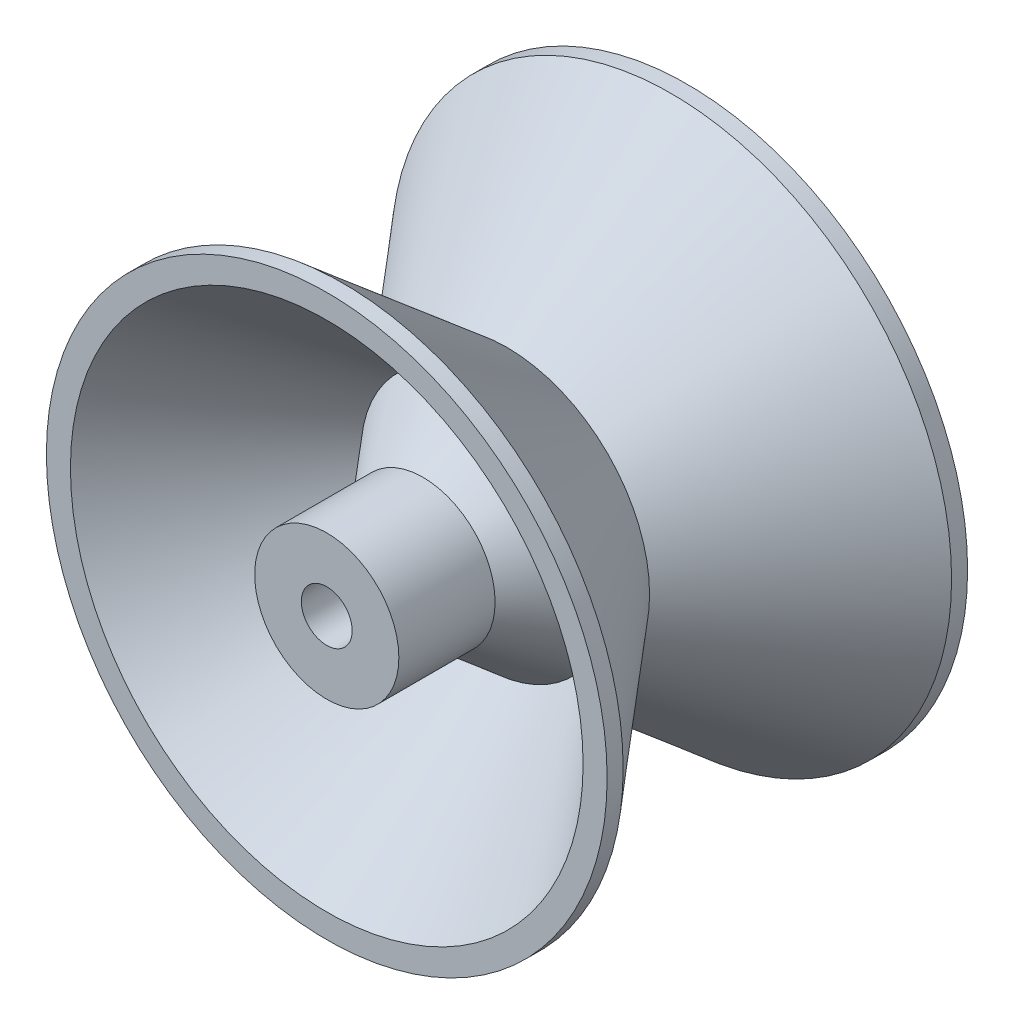
ISO-10303-21;
HEADER;
FILE_DESCRIPTION(('STEP AP214'),'2;1');
FILE_NAME('part.step','',(''),(''),'','','');
FILE_SCHEMA(('AUTOMOTIVE_DESIGN { 1 0 10303 214 1 1 1 1 }'));
ENDSEC;
DATA;
#1=APPLICATION_CONTEXT('core data for automotive mechanical design processes');
#2=APPLICATION_PROTOCOL_DEFINITION('international standard','automotive_design',2000,#1);
#3=PRODUCT_CONTEXT('',#1,'mechanical');
#4=PRODUCT('Part','Part','',(#3));
#5=PRODUCT_RELATED_PRODUCT_CATEGORY('part','',(#4));
#6=PRODUCT_DEFINITION_FORMATION('','',#4);
#7=PRODUCT_DEFINITION_CONTEXT('part definition',#1,'design');
#8=PRODUCT_DEFINITION('design','',#6,#7);
#9=PRODUCT_DEFINITION_SHAPE('','',#8);
#10=(LENGTH_UNIT() NAMED_UNIT(*) SI_UNIT(.MILLI.,.METRE.));
#11=(NAMED_UNIT(*) PLANE_ANGLE_UNIT() SI_UNIT($,.RADIAN.));
#12=(NAMED_UNIT(*) SI_UNIT($,.STERADIAN.) SOLID_ANGLE_UNIT());
#13=UNCERTAINTY_MEASURE_WITH_UNIT(LENGTH_MEASURE(1.E-05),#10,'distance_accuracy_value','');
#14=(GEOMETRIC_REPRESENTATION_CONTEXT(3) GLOBAL_UNCERTAINTY_ASSIGNED_CONTEXT((#13)) GLOBAL_UNIT_ASSIGNED_CONTEXT((#10,
#11,#12)) REPRESENTATION_CONTEXT('',''));
#15=CARTESIAN_POINT('',(0.,0.,0.));
#16=DIRECTION('',(0.,0.,1.));
#17=DIRECTION('',(1.,0.,0.));
#18=AXIS2_PLACEMENT_3D('',#15,#16,#17);
#19=CARTESIAN_POINT('',(9.,0.,0.));
#20=DIRECTION('',(0.,0.,1.));
#21=DIRECTION('',(1.,0.,0.));
#22=AXIS2_PLACEMENT_3D('',#19,#20,#21);
#23=PLANE('',#22);
#24=CARTESIAN_POINT('',(0.,0.,0.));
#25=DIRECTION('',(0.,0.,1.));
#26=DIRECTION('',(1.,0.,0.));
#27=AXIS2_PLACEMENT_3D('',#24,#25,#26);
#28=CIRCLE('',#27,9.);
#29=CARTESIAN_POINT('',(9.,0.,0.));
#30=VERTEX_POINT('',#29);
#31=EDGE_CURVE('E10',#30,#30,#28,.T.);
#32=ORIENTED_EDGE('',*,*,#31,.T.);
#33=EDGE_LOOP('',(#32));
#34=FACE_BOUND('',#33,.T.);
#35=CARTESIAN_POINT('',(0.,0.,0.));
#36=DIRECTION('',(0.,0.,1.));
#37=DIRECTION('',(1.,0.,0.));
#38=AXIS2_PLACEMENT_3D('',#35,#36,#37);
#39=CIRCLE('',#38,3.175);
#40=CARTESIAN_POINT('',(3.175,0.,0.));
#41=VERTEX_POINT('',#40);
#42=EDGE_CURVE('E92',#41,#41,#39,.T.);
#43=ORIENTED_EDGE('',*,*,#42,.F.);
#44=EDGE_LOOP('',(#43));
#45=FACE_BOUND('',#44,.T.);
#46=ADVANCED_FACE('F31',(#34,#45),#23,.T.);
#47=CARTESIAN_POINT('',(0.,0.,0.));
#48=DIRECTION('',(0.,0.,1.));
#49=DIRECTION('',(1.,0.,0.));
#50=AXIS2_PLACEMENT_3D('',#47,#48,#49);
#51=CYLINDRICAL_SURFACE('',#50,9.);
#52=CARTESIAN_POINT('',(0.,0.,-12.0144065925504));
#53=DIRECTION('',(0.,0.,1.));
#54=DIRECTION('',(1.,0.,0.));
#55=AXIS2_PLACEMENT_3D('',#52,#53,#54);
#56=CIRCLE('',#55,9.);
#57=CARTESIAN_POINT('',(9.,0.,-12.0144065925504));
#58=VERTEX_POINT('',#57);
#59=EDGE_CURVE('E37',#58,#58,#56,.T.);
#60=ORIENTED_EDGE('',*,*,#59,.T.);
#61=EDGE_LOOP('',(#60));
#62=FACE_BOUND('',#61,.T.);
#63=ORIENTED_EDGE('',*,*,#31,.F.);
#64=EDGE_LOOP('',(#63));
#65=FACE_BOUND('',#64,.T.);
#66=ADVANCED_FACE('F100',(#62,#65),#51,.T.);
#67=CARTESIAN_POINT('',(0.,0.,-12.0144065925504));
#68=DIRECTION('',(0.,0.,-1.));
#69=DIRECTION('',(-1.,0.,0.));
#70=AXIS2_PLACEMENT_3D('',#67,#68,#69);
#71=CONICAL_SURFACE('',#70,9.,0.69813170079773);
#72=CARTESIAN_POINT('',(0.,0.,-19.7123696111087));
#73=DIRECTION('',(0.,0.,1.));
#74=DIRECTION('',(1.,0.,0.));
#75=AXIS2_PLACEMENT_3D('',#72,#73,#74);
#76=CIRCLE('',#75,15.4593579296886);
#77=CARTESIAN_POINT('',(15.4593579296886,0.,-19.7123696111087));
#78=VERTEX_POINT('',#77);
#79=EDGE_CURVE('E41',#78,#78,#76,.T.);
#80=ORIENTED_EDGE('',*,*,#79,.T.);
#81=EDGE_LOOP('',(#80));
#82=FACE_BOUND('',#81,.T.);
#83=ORIENTED_EDGE('',*,*,#59,.F.);
#84=EDGE_LOOP('',(#83));
#85=FACE_BOUND('',#84,.T.);
#86=ADVANCED_FACE('F104',(#82,#85),#71,.T.);
#87=CARTESIAN_POINT('',(0.,0.,-19.7123696111087));
#88=DIRECTION('',(0.,0.,1.));
#89=DIRECTION('',(1.,0.,0.));
#90=AXIS2_PLACEMENT_3D('',#87,#88,#89);
#91=CONICAL_SURFACE('',#90,15.4593579296886,0.698131700797729);
#92=CARTESIAN_POINT('',(0.,0.,0.));
#93=DIRECTION('',(0.,0.,1.));
#94=DIRECTION('',(1.,0.,0.));
#95=AXIS2_PLACEMENT_3D('',#92,#93,#94);
#96=CIRCLE('',#95,32.);
#97=CARTESIAN_POINT('',(32.,0.,0.));
#98=VERTEX_POINT('',#97);
#99=EDGE_CURVE('E45',#98,#98,#96,.T.);
#100=ORIENTED_EDGE('',*,*,#99,.T.);
#101=EDGE_LOOP('',(#100));
#102=FACE_BOUND('',#101,.T.);
#103=ORIENTED_EDGE('',*,*,#79,.F.);
#104=EDGE_LOOP('',(#103));
#105=FACE_BOUND('',#104,.T.);
#106=ADVANCED_FACE('F108',(#102,#105),#91,.F.);
#107=CARTESIAN_POINT('',(35.,0.,0.));
#108=DIRECTION('',(0.,0.,1.));
#109=DIRECTION('',(1.,0.,0.));
#110=AXIS2_PLACEMENT_3D('',#107,#108,#109);
#111=PLANE('',#110);
#112=CARTESIAN_POINT('',(0.,0.,0.));
#113=DIRECTION('',(0.,0.,1.));
#114=DIRECTION('',(1.,0.,0.));
#115=AXIS2_PLACEMENT_3D('',#112,#113,#114);
#116=CIRCLE('',#115,35.);
#117=CARTESIAN_POINT('',(35.,0.,0.));
#118=VERTEX_POINT('',#117);
#119=EDGE_CURVE('E50',#118,#118,#116,.T.);
#120=ORIENTED_EDGE('',*,*,#119,.T.);
#121=EDGE_LOOP('',(#120));
#122=FACE_BOUND('',#121,.T.);
#123=ORIENTED_EDGE('',*,*,#99,.F.);
#124=EDGE_LOOP('',(#123));
#125=FACE_BOUND('',#124,.T.);
#126=ADVANCED_FACE('F115',(#122,#125),#111,.T.);
#127=CARTESIAN_POINT('',(0.,0.,0.));
#128=DIRECTION('',(0.,0.,1.));
#129=DIRECTION('',(1.,0.,0.));
#130=AXIS2_PLACEMENT_3D('',#127,#128,#129);
#131=CYLINDRICAL_SURFACE('',#130,35.);
#132=CARTESIAN_POINT('',(0.,0.,-2.));
#133=DIRECTION('',(0.,0.,1.));
#134=DIRECTION('',(1.,0.,0.));
#135=AXIS2_PLACEMENT_3D('',#132,#133,#134);
#136=CIRCLE('',#135,35.);
#137=CARTESIAN_POINT('',(35.,0.,-2.));
#138=VERTEX_POINT('',#137);
#139=EDGE_CURVE('E53',#138,#138,#136,.T.);
#140=ORIENTED_EDGE('',*,*,#139,.T.);
#141=EDGE_LOOP('',(#140));
#142=FACE_BOUND('',#141,.T.);
#143=ORIENTED_EDGE('',*,*,#119,.F.);
#144=EDGE_LOOP('',(#143));
#145=FACE_BOUND('',#144,.T.);
#146=ADVANCED_FACE('F119',(#142,#145),#131,.T.);
#147=CARTESIAN_POINT('',(0.,0.,-2.));
#148=DIRECTION('',(0.,0.,1.));
#149=DIRECTION('',(1.,0.,0.));
#150=AXIS2_PLACEMENT_3D('',#147,#148,#149);
#151=CONICAL_SURFACE('',#150,35.,0.69813170079773);
#152=CARTESIAN_POINT('',(0.,0.,-22.5));
#153=DIRECTION('',(0.,0.,1.));
#154=DIRECTION('',(1.,0.,0.));
#155=AXIS2_PLACEMENT_3D('',#152,#153,#154);
#156=CIRCLE('',#155,17.7984575608658);
#157=CARTESIAN_POINT('',(17.7984575608658,0.,-22.5));
#158=VERTEX_POINT('',#157);
#159=EDGE_CURVE('E56',#158,#158,#156,.T.);
#160=ORIENTED_EDGE('',*,*,#159,.T.);
#161=EDGE_LOOP('',(#160));
#162=FACE_BOUND('',#161,.T.);
#163=ORIENTED_EDGE('',*,*,#139,.F.);
#164=EDGE_LOOP('',(#163));
#165=FACE_BOUND('',#164,.T.);
#166=ADVANCED_FACE('F123',(#162,#165),#151,.T.);
#167=CARTESIAN_POINT('',(0.,0.,-22.5));
#168=DIRECTION('',(0.,0.,-1.));
#169=DIRECTION('',(-1.,0.,0.));
#170=AXIS2_PLACEMENT_3D('',#167,#168,#169);
#171=CONICAL_SURFACE('',#170,17.7984575608658,0.698131700797735);
#172=CARTESIAN_POINT('',(0.,0.,-43.));
#173=DIRECTION('',(0.,0.,1.));
#174=DIRECTION('',(1.,0.,0.));
#175=AXIS2_PLACEMENT_3D('',#172,#173,#174);
#176=CIRCLE('',#175,35.0000000000002);
#177=CARTESIAN_POINT('',(35.0000000000002,0.,-43.));
#178=VERTEX_POINT('',#177);
#179=EDGE_CURVE('E59',#178,#178,#176,.T.);
#180=ORIENTED_EDGE('',*,*,#179,.T.);
#181=EDGE_LOOP('',(#180));
#182=FACE_BOUND('',#181,.T.);
#183=ORIENTED_EDGE('',*,*,#159,.F.);
#184=EDGE_LOOP('',(#183));
#185=FACE_BOUND('',#184,.T.);
#186=ADVANCED_FACE('F127',(#182,#185),#171,.T.);
#187=CARTESIAN_POINT('',(0.,0.,0.));
#188=DIRECTION('',(0.,0.,1.));
#189=DIRECTION('',(1.,0.,0.));
#190=AXIS2_PLACEMENT_3D('',#187,#188,#189);
#191=CYLINDRICAL_SURFACE('',#190,35.0000000000002);
#192=CARTESIAN_POINT('',(0.,0.,-45.));
#193=DIRECTION('',(0.,0.,1.));
#194=DIRECTION('',(1.,0.,0.));
#195=AXIS2_PLACEMENT_3D('',#192,#193,#194);
#196=CIRCLE('',#195,35.0000000000002);
#197=CARTESIAN_POINT('',(35.0000000000002,0.,-45.));
#198=VERTEX_POINT('',#197);
#199=EDGE_CURVE('E62',#198,#198,#196,.T.);
#200=ORIENTED_EDGE('',*,*,#199,.T.);
#201=EDGE_LOOP('',(#200));
#202=FACE_BOUND('',#201,.T.);
#203=ORIENTED_EDGE('',*,*,#179,.F.);
#204=EDGE_LOOP('',(#203));
#205=FACE_BOUND('',#204,.T.);
#206=ADVANCED_FACE('F131',(#202,#205),#191,.T.);
#207=CARTESIAN_POINT('',(32.0000000000002,0.,-45.));
#208=DIRECTION('',(0.,0.,-1.));
#209=DIRECTION('',(-1.,0.,0.));
#210=AXIS2_PLACEMENT_3D('',#207,#208,#209);
#211=PLANE('',#210);
#212=CARTESIAN_POINT('',(0.,0.,-45.));
#213=DIRECTION('',(0.,0.,1.));
#214=DIRECTION('',(1.,0.,0.));
#215=AXIS2_PLACEMENT_3D('',#212,#213,#214);
#216=CIRCLE('',#215,32.0000000000002);
#217=CARTESIAN_POINT('',(32.0000000000002,0.,-45.));
#218=VERTEX_POINT('',#217);
#219=EDGE_CURVE('E65',#218,#218,#216,.T.);
#220=ORIENTED_EDGE('',*,*,#219,.T.);
#221=EDGE_LOOP('',(#220));
#222=FACE_BOUND('',#221,.T.);
#223=ORIENTED_EDGE('',*,*,#199,.F.);
#224=EDGE_LOOP('',(#223));
#225=FACE_BOUND('',#224,.T.);
#226=ADVANCED_FACE('F135',(#222,#225),#211,.T.);
#227=CARTESIAN_POINT('',(0.,0.,-45.));
#228=DIRECTION('',(0.,0.,-1.));
#229=DIRECTION('',(-1.,0.,0.));
#230=AXIS2_PLACEMENT_3D('',#227,#228,#229);
#231=CONICAL_SURFACE('',#230,32.0000000000002,0.698131700797734);
#232=CARTESIAN_POINT('',(0.,0.,-25.2876303888913));
#233=DIRECTION('',(0.,0.,1.));
#234=DIRECTION('',(1.,0.,0.));
#235=AXIS2_PLACEMENT_3D('',#232,#233,#234);
#236=CIRCLE('',#235,15.4593579296886);
#237=CARTESIAN_POINT('',(15.4593579296886,0.,-25.2876303888913));
#238=VERTEX_POINT('',#237);
#239=EDGE_CURVE('E68',#238,#238,#236,.T.);
#240=ORIENTED_EDGE('',*,*,#239,.T.);
#241=EDGE_LOOP('',(#240));
#242=FACE_BOUND('',#241,.T.);
#243=ORIENTED_EDGE('',*,*,#219,.F.);
#244=EDGE_LOOP('',(#243));
#245=FACE_BOUND('',#244,.T.);
#246=ADVANCED_FACE('F139',(#242,#245),#231,.F.);
#247=CARTESIAN_POINT('',(0.,0.,-25.2876303888913));
#248=DIRECTION('',(0.,0.,1.));
#249=DIRECTION('',(1.,0.,0.));
#250=AXIS2_PLACEMENT_3D('',#247,#248,#249);
#251=CONICAL_SURFACE('',#250,15.4593579296886,0.69813170079773);
#252=CARTESIAN_POINT('',(0.,0.,-32.9855934074496));
#253=DIRECTION('',(0.,0.,1.));
#254=DIRECTION('',(1.,0.,0.));
#255=AXIS2_PLACEMENT_3D('',#252,#253,#254);
#256=CIRCLE('',#255,9.);
#257=CARTESIAN_POINT('',(9.,0.,-32.9855934074496));
#258=VERTEX_POINT('',#257);
#259=EDGE_CURVE('E71',#258,#258,#256,.T.);
#260=ORIENTED_EDGE('',*,*,#259,.T.);
#261=EDGE_LOOP('',(#260));
#262=FACE_BOUND('',#261,.T.);
#263=ORIENTED_EDGE('',*,*,#239,.F.);
#264=EDGE_LOOP('',(#263));
#265=FACE_BOUND('',#264,.T.);
#266=ADVANCED_FACE('F143',(#262,#265),#251,.T.);
#267=CARTESIAN_POINT('',(0.,0.,0.));
#268=DIRECTION('',(0.,0.,1.));
#269=DIRECTION('',(1.,0.,0.));
#270=AXIS2_PLACEMENT_3D('',#267,#268,#269);
#271=CYLINDRICAL_SURFACE('',#270,9.);
#272=CARTESIAN_POINT('',(0.,0.,-45.));
#273=DIRECTION('',(0.,0.,1.));
#274=DIRECTION('',(1.,0.,0.));
#275=AXIS2_PLACEMENT_3D('',#272,#273,#274);
#276=CIRCLE('',#275,9.);
#277=CARTESIAN_POINT('',(9.,0.,-45.));
#278=VERTEX_POINT('',#277);
#279=EDGE_CURVE('E74',#278,#278,#276,.T.);
#280=ORIENTED_EDGE('',*,*,#279,.T.);
#281=EDGE_LOOP('',(#280));
#282=FACE_BOUND('',#281,.T.);
#283=ORIENTED_EDGE('',*,*,#259,.F.);
#284=EDGE_LOOP('',(#283));
#285=FACE_BOUND('',#284,.T.);
#286=ADVANCED_FACE('F147',(#282,#285),#271,.T.);
#287=CARTESIAN_POINT('',(3.175,0.,-45.));
#288=DIRECTION('',(0.,0.,-1.));
#289=DIRECTION('',(-1.,0.,0.));
#290=AXIS2_PLACEMENT_3D('',#287,#288,#289);
#291=PLANE('',#290);
#292=CARTESIAN_POINT('',(0.,0.,-45.));
#293=DIRECTION('',(0.,0.,1.));
#294=DIRECTION('',(1.,0.,0.));
#295=AXIS2_PLACEMENT_3D('',#292,#293,#294);
#296=CIRCLE('',#295,3.175);
#297=CARTESIAN_POINT('',(3.175,0.,-45.));
#298=VERTEX_POINT('',#297);
#299=EDGE_CURVE('E77',#298,#298,#296,.T.);
#300=ORIENTED_EDGE('',*,*,#299,.T.);
#301=EDGE_LOOP('',(#300));
#302=FACE_BOUND('',#301,.T.);
#303=ORIENTED_EDGE('',*,*,#279,.F.);
#304=EDGE_LOOP('',(#303));
#305=FACE_BOUND('',#304,.T.);
#306=ADVANCED_FACE('F151',(#302,#305),#291,.T.);
#307=CARTESIAN_POINT('',(0.,0.,0.));
#308=DIRECTION('',(0.,0.,1.));
#309=DIRECTION('',(1.,0.,0.));
#310=AXIS2_PLACEMENT_3D('',#307,#308,#309);
#311=CYLINDRICAL_SURFACE('',#310,3.175);
#312=CARTESIAN_POINT('',(0.,0.,-40.));
#313=DIRECTION('',(0.,0.,1.));
#314=DIRECTION('',(1.,0.,0.));
#315=AXIS2_PLACEMENT_3D('',#312,#313,#314);
#316=CIRCLE('',#315,3.175);
#317=CARTESIAN_POINT('',(3.175,0.,-40.));
#318=VERTEX_POINT('',#317);
#319=EDGE_CURVE('E80',#318,#318,#316,.T.);
#320=ORIENTED_EDGE('',*,*,#319,.T.);
#321=EDGE_LOOP('',(#320));
#322=FACE_BOUND('',#321,.T.);
#323=ORIENTED_EDGE('',*,*,#299,.F.);
#324=EDGE_LOOP('',(#323));
#325=FACE_BOUND('',#324,.T.);
#326=ADVANCED_FACE('F155',(#322,#325),#311,.F.);
#327=CARTESIAN_POINT('',(0.,0.,-34.9858537094953));
#328=DIRECTION('',(0.,0.,1.));
#329=DIRECTION('',(1.,0.,0.));
#330=AXIS2_PLACEMENT_3D('',#327,#328,#329);
#331=DEGENERATE_TOROIDAL_SURFACE('',#330,2.80062685550186,7.80062685550186,.F.);
#332=CARTESIAN_POINT('',(0.,0.,-34.9858537094953));
#333=DIRECTION('',(0.,0.,1.));
#334=DIRECTION('',(1.,0.,0.));
#335=AXIS2_PLACEMENT_3D('',#332,#333,#334);
#336=CIRCLE('',#335,5.);
#337=CARTESIAN_POINT('',(5.,0.,-34.9858537094953));
#338=VERTEX_POINT('',#337);
#339=EDGE_CURVE('E83',#338,#338,#336,.T.);
#340=ORIENTED_EDGE('',*,*,#339,.T.);
#341=EDGE_LOOP('',(#340));
#342=FACE_BOUND('',#341,.T.);
#343=ORIENTED_EDGE('',*,*,#319,.F.);
#344=EDGE_LOOP('',(#343));
#345=FACE_BOUND('',#344,.T.);
#346=ADVANCED_FACE('F159',(#342,#345),#331,.T.);
#347=CARTESIAN_POINT('',(0.,0.,0.));
#348=DIRECTION('',(0.,0.,1.));
#349=DIRECTION('',(1.,0.,0.));
#350=AXIS2_PLACEMENT_3D('',#347,#348,#349);
#351=CYLINDRICAL_SURFACE('',#350,5.);
#352=CARTESIAN_POINT('',(0.,0.,-10.0141462905047));
#353=DIRECTION('',(0.,0.,1.));
#354=DIRECTION('',(1.,0.,0.));
#355=AXIS2_PLACEMENT_3D('',#352,#353,#354);
#356=CIRCLE('',#355,5.);
#357=CARTESIAN_POINT('',(5.,0.,-10.0141462905047));
#358=VERTEX_POINT('',#357);
#359=EDGE_CURVE('E86',#358,#358,#356,.T.);
#360=ORIENTED_EDGE('',*,*,#359,.T.);
#361=EDGE_LOOP('',(#360));
#362=FACE_BOUND('',#361,.T.);
#363=ORIENTED_EDGE('',*,*,#339,.F.);
#364=EDGE_LOOP('',(#363));
#365=FACE_BOUND('',#364,.T.);
#366=ADVANCED_FACE('F163',(#362,#365),#351,.F.);
#367=CARTESIAN_POINT('',(0.,0.,-10.0141462905047));
#368=DIRECTION('',(0.,0.,1.));
#369=DIRECTION('',(1.,0.,0.));
#370=AXIS2_PLACEMENT_3D('',#367,#368,#369);
#371=DEGENERATE_TOROIDAL_SURFACE('',#370,2.80062685550186,7.80062685550186,.F.);
#372=CARTESIAN_POINT('',(0.,0.,-4.99999999999999));
#373=DIRECTION('',(0.,0.,1.));
#374=DIRECTION('',(1.,0.,0.));
#375=AXIS2_PLACEMENT_3D('',#372,#373,#374);
#376=CIRCLE('',#375,3.175);
#377=CARTESIAN_POINT('',(3.175,0.,-4.99999999999999));
#378=VERTEX_POINT('',#377);
#379=EDGE_CURVE('E89',#378,#378,#376,.T.);
#380=ORIENTED_EDGE('',*,*,#379,.T.);
#381=EDGE_LOOP('',(#380));
#382=FACE_BOUND('',#381,.T.);
#383=ORIENTED_EDGE('',*,*,#359,.F.);
#384=EDGE_LOOP('',(#383));
#385=FACE_BOUND('',#384,.T.);
#386=ADVANCED_FACE('F167',(#382,#385),#371,.T.);
#387=CARTESIAN_POINT('',(0.,0.,0.));
#388=DIRECTION('',(0.,0.,1.));
#389=DIRECTION('',(1.,0.,0.));
#390=AXIS2_PLACEMENT_3D('',#387,#388,#389);
#391=CYLINDRICAL_SURFACE('',#390,3.175);
#392=ORIENTED_EDGE('',*,*,#42,.T.);
#393=EDGE_LOOP('',(#392));
#394=FACE_BOUND('',#393,.T.);
#395=ORIENTED_EDGE('',*,*,#379,.F.);
#396=EDGE_LOOP('',(#395));
#397=FACE_BOUND('',#396,.T.);
#398=ADVANCED_FACE('F96',(#394,#397),#391,.F.);
#399=CLOSED_SHELL('',(#46,#66,#86,#106,#126,#146,#166,#186,#206,#226,#246,#266,#286,#306,#326,
#346,#366,#386,#398));
#400=MANIFOLD_SOLID_BREP('B2',#399);
#401=ADVANCED_BREP_SHAPE_REPRESENTATION('',(#18,#400),#14);
#402=SHAPE_DEFINITION_REPRESENTATION(#9,#401);
ENDSEC;
END-ISO-10303-21;
